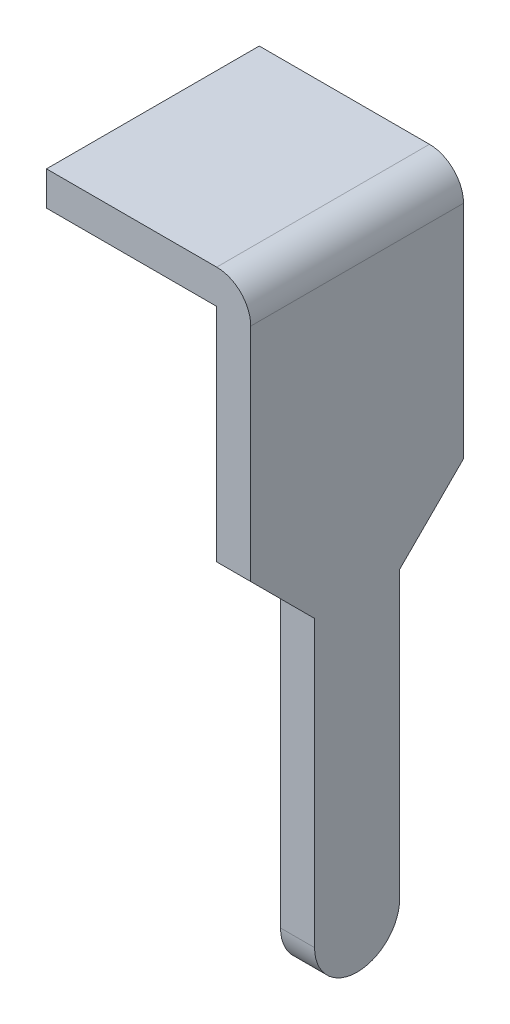
ISO-10303-21;
HEADER;
FILE_DESCRIPTION(('STEP AP214'),'2;1');
FILE_NAME('part.step','',(''),(''),'','','');
FILE_SCHEMA(('AUTOMOTIVE_DESIGN { 1 0 10303 214 1 1 1 1 }'));
ENDSEC;
DATA;
#1=APPLICATION_CONTEXT('core data for automotive mechanical design processes');
#2=APPLICATION_PROTOCOL_DEFINITION('international standard','automotive_design',2000,#1);
#3=PRODUCT_CONTEXT('',#1,'mechanical');
#4=PRODUCT('Part','Part','',(#3));
#5=PRODUCT_RELATED_PRODUCT_CATEGORY('part','',(#4));
#6=PRODUCT_DEFINITION_FORMATION('','',#4);
#7=PRODUCT_DEFINITION_CONTEXT('part definition',#1,'design');
#8=PRODUCT_DEFINITION('design','',#6,#7);
#9=PRODUCT_DEFINITION_SHAPE('','',#8);
#10=(LENGTH_UNIT() NAMED_UNIT(*) SI_UNIT(.MILLI.,.METRE.));
#11=(NAMED_UNIT(*) PLANE_ANGLE_UNIT() SI_UNIT($,.RADIAN.));
#12=(NAMED_UNIT(*) SI_UNIT($,.STERADIAN.) SOLID_ANGLE_UNIT());
#13=UNCERTAINTY_MEASURE_WITH_UNIT(LENGTH_MEASURE(1.E-05),#10,'distance_accuracy_value','');
#14=(GEOMETRIC_REPRESENTATION_CONTEXT(3) GLOBAL_UNCERTAINTY_ASSIGNED_CONTEXT((#13)) GLOBAL_UNIT_ASSIGNED_CONTEXT((#10,
#11,#12)) REPRESENTATION_CONTEXT('',''));
#15=CARTESIAN_POINT('',(0.,0.,0.));
#16=DIRECTION('',(0.,0.,1.));
#17=DIRECTION('',(1.,0.,0.));
#18=AXIS2_PLACEMENT_3D('',#15,#16,#17);
#19=CARTESIAN_POINT('',(2.5,3.7,-12.75));
#20=DIRECTION('',(-1.,0.,0.));
#21=DIRECTION('',(0.,0.,1.));
#22=AXIS2_PLACEMENT_3D('',#19,#20,#21);
#23=PLANE('',#22);
#24=DIRECTION('',(0.,1.,0.));
#25=VECTOR('',#24,1.);
#26=CARTESIAN_POINT('',(2.5,3.7,-10.25));
#27=LINE('',#26,#25);
#28=CARTESIAN_POINT('',(2.49999999999867,3.7,-10.25));
#29=VERTEX_POINT('',#28);
#30=CARTESIAN_POINT('',(2.49999999999867,4.1,-10.25));
#31=VERTEX_POINT('',#30);
#32=EDGE_CURVE('E190',#29,#31,#27,.T.);
#33=ORIENTED_EDGE('',*,*,#32,.T.);
#34=DIRECTION('',(0.,0.,-1.));
#35=VECTOR('',#34,1.);
#36=CARTESIAN_POINT('',(2.499999999998,4.1,-12.75));
#37=LINE('',#36,#35);
#38=CARTESIAN_POINT('',(2.49999999999867,4.1,-12.75));
#39=VERTEX_POINT('',#38);
#40=EDGE_CURVE('E158',#31,#39,#37,.T.);
#41=ORIENTED_EDGE('',*,*,#40,.T.);
#42=DIRECTION('',(0.,1.,0.));
#43=VECTOR('',#42,1.);
#44=CARTESIAN_POINT('',(2.5,3.7,-12.75));
#45=LINE('',#44,#43);
#46=CARTESIAN_POINT('',(2.49999999999867,3.7,-12.75));
#47=VERTEX_POINT('',#46);
#48=EDGE_CURVE('E207',#39,#47,#45,.F.);
#49=ORIENTED_EDGE('',*,*,#48,.T.);
#50=DIRECTION('',(0.,0.,1.));
#51=VECTOR('',#50,1.);
#52=CARTESIAN_POINT('',(2.499999999998,3.7,-10.25));
#53=LINE('',#52,#51);
#54=EDGE_CURVE('E181',#47,#29,#53,.T.);
#55=ORIENTED_EDGE('',*,*,#54,.T.);
#56=EDGE_LOOP('',(#33,#41,#49,#55));
#57=FACE_BOUND('',#56,.T.);
#58=ADVANCED_FACE('F17',(#57),#23,.T.);
#59=CARTESIAN_POINT('',(4.9,3.7,-10.25));
#60=DIRECTION('',(0.,1.,0.));
#61=DIRECTION('',(0.,0.,1.));
#62=AXIS2_PLACEMENT_3D('',#59,#60,#61);
#63=PLANE('',#62);
#64=DIRECTION('',(-1.,0.,0.));
#65=VECTOR('',#64,1.);
#66=CARTESIAN_POINT('',(4.9,3.7,-10.25));
#67=LINE('',#66,#65);
#68=CARTESIAN_POINT('',(4.5,3.7,-10.25));
#69=VERTEX_POINT('',#68);
#70=EDGE_CURVE('E197',#69,#29,#67,.T.);
#71=ORIENTED_EDGE('',*,*,#70,.T.);
#72=ORIENTED_EDGE('',*,*,#54,.F.);
#73=DIRECTION('',(1.,0.,0.));
#74=VECTOR('',#73,1.);
#75=CARTESIAN_POINT('',(4.9,3.7,-12.75));
#76=LINE('',#75,#74);
#77=CARTESIAN_POINT('',(4.5,3.7,-12.75));
#78=VERTEX_POINT('',#77);
#79=EDGE_CURVE('E177',#47,#78,#76,.T.);
#80=ORIENTED_EDGE('',*,*,#79,.T.);
#81=DIRECTION('',(0.,0.,-1.));
#82=VECTOR('',#81,1.);
#83=CARTESIAN_POINT('',(4.5,3.7,-10.25));
#84=LINE('',#83,#82);
#85=EDGE_CURVE('E162',#78,#69,#84,.F.);
#86=ORIENTED_EDGE('',*,*,#85,.T.);
#87=EDGE_LOOP('',(#71,#72,#80,#86));
#88=FACE_BOUND('',#87,.T.);
#89=ADVANCED_FACE('F287',(#88),#63,.F.);
#90=CARTESIAN_POINT('',(4.5,1.1,-10.25));
#91=DIRECTION('',(1.,0.,0.));
#92=DIRECTION('',(0.,0.,-1.));
#93=AXIS2_PLACEMENT_3D('',#90,#91,#92);
#94=PLANE('',#93);
#95=ORIENTED_EDGE('',*,*,#85,.F.);
#96=DIRECTION('',(0.,-1.,0.));
#97=VECTOR('',#96,1.);
#98=CARTESIAN_POINT('',(4.5,3.7,-12.75));
#99=LINE('',#98,#97);
#100=CARTESIAN_POINT('',(4.5,1.1,-12.75));
#101=VERTEX_POINT('',#100);
#102=EDGE_CURVE('E173',#78,#101,#99,.T.);
#103=ORIENTED_EDGE('',*,*,#102,.T.);
#104=DIRECTION('',(0.,0.707106781186548,-0.707106781186548));
#105=VECTOR('',#104,1.);
#106=CARTESIAN_POINT('',(4.5,1.1,-12.75));
#107=LINE('',#106,#105);
#108=CARTESIAN_POINT('',(4.5,0.35,-12.));
#109=VERTEX_POINT('',#108);
#110=EDGE_CURVE('E161',#109,#101,#107,.T.);
#111=ORIENTED_EDGE('',*,*,#110,.F.);
#112=DIRECTION('',(0.,1.,0.));
#113=VECTOR('',#112,1.);
#114=CARTESIAN_POINT('',(4.5,0.35,-12.));
#115=LINE('',#114,#113);
#116=CARTESIAN_POINT('',(4.5,-3.,-12.));
#117=VERTEX_POINT('',#116);
#118=EDGE_CURVE('E75',#117,#109,#115,.T.);
#119=ORIENTED_EDGE('',*,*,#118,.F.);
#120=CARTESIAN_POINT('',(4.5,-3.,-11.5));
#121=DIRECTION('',(-1.,0.,0.));
#122=DIRECTION('',(0.,0.,1.));
#123=AXIS2_PLACEMENT_3D('',#120,#121,#122);
#124=CIRCLE('',#123,0.5);
#125=CARTESIAN_POINT('',(4.5,-3.,-11.));
#126=VERTEX_POINT('',#125);
#127=EDGE_CURVE('E20',#126,#117,#124,.F.);
#128=ORIENTED_EDGE('',*,*,#127,.F.);
#129=DIRECTION('',(0.,1.,0.));
#130=VECTOR('',#129,1.);
#131=CARTESIAN_POINT('',(4.5,0.35,-11.));
#132=LINE('',#131,#130);
#133=CARTESIAN_POINT('',(4.5,0.350000000000001,-11.));
#134=VERTEX_POINT('',#133);
#135=EDGE_CURVE('E59',#134,#126,#132,.F.);
#136=ORIENTED_EDGE('',*,*,#135,.F.);
#137=DIRECTION('',(0.,-0.707106781186548,-0.707106781186548));
#138=VECTOR('',#137,1.);
#139=CARTESIAN_POINT('',(4.5,1.1,-10.25));
#140=LINE('',#139,#138);
#141=CARTESIAN_POINT('',(4.5,1.1,-10.25));
#142=VERTEX_POINT('',#141);
#143=EDGE_CURVE('E149',#142,#134,#140,.T.);
#144=ORIENTED_EDGE('',*,*,#143,.F.);
#145=DIRECTION('',(0.,1.,0.));
#146=VECTOR('',#145,1.);
#147=CARTESIAN_POINT('',(4.5,4.1,-10.25));
#148=LINE('',#147,#146);
#149=EDGE_CURVE('E124',#142,#69,#148,.T.);
#150=ORIENTED_EDGE('',*,*,#149,.T.);
#151=EDGE_LOOP('',(#95,#103,#111,#119,#128,#136,#144,#150));
#152=FACE_BOUND('',#151,.T.);
#153=ADVANCED_FACE('F285',(#152),#94,.F.);
#154=CARTESIAN_POINT('',(4.9,4.1,-12.75));
#155=DIRECTION('',(0.,-1.,0.));
#156=DIRECTION('',(0.,0.,-1.));
#157=AXIS2_PLACEMENT_3D('',#154,#155,#156);
#158=PLANE('',#157);
#159=DIRECTION('',(0.,0.,-1.));
#160=VECTOR('',#159,1.);
#161=CARTESIAN_POINT('',(4.5,4.1,-10.25));
#162=LINE('',#161,#160);
#163=CARTESIAN_POINT('',(4.5,4.1,-12.75));
#164=VERTEX_POINT('',#163);
#165=CARTESIAN_POINT('',(4.5,4.1,-10.25));
#166=VERTEX_POINT('',#165);
#167=EDGE_CURVE('E165',#164,#166,#162,.F.);
#168=ORIENTED_EDGE('',*,*,#167,.F.);
#169=DIRECTION('',(1.,0.,0.));
#170=VECTOR('',#169,1.);
#171=CARTESIAN_POINT('',(4.9,4.1,-12.75));
#172=LINE('',#171,#170);
#173=EDGE_CURVE('E219',#164,#39,#172,.F.);
#174=ORIENTED_EDGE('',*,*,#173,.T.);
#175=ORIENTED_EDGE('',*,*,#40,.F.);
#176=DIRECTION('',(-1.,0.,0.));
#177=VECTOR('',#176,1.);
#178=CARTESIAN_POINT('',(4.9,4.1,-10.25));
#179=LINE('',#178,#177);
#180=EDGE_CURVE('E168',#31,#166,#179,.F.);
#181=ORIENTED_EDGE('',*,*,#180,.T.);
#182=EDGE_LOOP('',(#168,#174,#175,#181));
#183=FACE_BOUND('',#182,.T.);
#184=ADVANCED_FACE('F282',(#183),#158,.F.);
#185=CARTESIAN_POINT('',(4.5,1.1,-12.75));
#186=DIRECTION('',(0.,-0.707106781186548,-0.707106781186548));
#187=DIRECTION('',(0.,0.707106781186548,-0.707106781186548));
#188=AXIS2_PLACEMENT_3D('',#185,#186,#187);
#189=PLANE('',#188);
#190=ORIENTED_EDGE('',*,*,#110,.T.);
#191=DIRECTION('',(1.,0.,0.));
#192=VECTOR('',#191,1.);
#193=CARTESIAN_POINT('',(4.9,1.1,-12.75));
#194=LINE('',#193,#192);
#195=CARTESIAN_POINT('',(4.9,1.1,-12.75));
#196=VERTEX_POINT('',#195);
#197=EDGE_CURVE('E176',#101,#196,#194,.T.);
#198=ORIENTED_EDGE('',*,*,#197,.T.);
#199=DIRECTION('',(0.,-0.707106781186547,0.707106781186548));
#200=VECTOR('',#199,1.);
#201=CARTESIAN_POINT('',(4.9,1.1,-12.75));
#202=LINE('',#201,#200);
#203=CARTESIAN_POINT('',(4.9,0.35,-12.));
#204=VERTEX_POINT('',#203);
#205=EDGE_CURVE('E234',#196,#204,#202,.T.);
#206=ORIENTED_EDGE('',*,*,#205,.T.);
#207=DIRECTION('',(-1.,0.,0.));
#208=VECTOR('',#207,1.);
#209=CARTESIAN_POINT('',(4.5,0.35,-12.));
#210=LINE('',#209,#208);
#211=EDGE_CURVE('E103',#109,#204,#210,.F.);
#212=ORIENTED_EDGE('',*,*,#211,.F.);
#213=EDGE_LOOP('',(#190,#198,#206,#212));
#214=FACE_BOUND('',#213,.T.);
#215=ADVANCED_FACE('F254',(#214),#189,.T.);
#216=CARTESIAN_POINT('',(4.5,0.35,-12.));
#217=DIRECTION('',(0.,0.,-1.));
#218=DIRECTION('',(-1.,0.,0.));
#219=AXIS2_PLACEMENT_3D('',#216,#217,#218);
#220=PLANE('',#219);
#221=ORIENTED_EDGE('',*,*,#118,.T.);
#222=ORIENTED_EDGE('',*,*,#211,.T.);
#223=DIRECTION('',(0.,1.,0.));
#224=VECTOR('',#223,1.);
#225=CARTESIAN_POINT('',(4.9,3.7,-12.));
#226=LINE('',#225,#224);
#227=CARTESIAN_POINT('',(4.9,-3.,-12.));
#228=VERTEX_POINT('',#227);
#229=EDGE_CURVE('E218',#204,#228,#226,.F.);
#230=ORIENTED_EDGE('',*,*,#229,.T.);
#231=DIRECTION('',(-1.,0.,0.));
#232=VECTOR('',#231,1.);
#233=CARTESIAN_POINT('',(4.5,-3.,-12.));
#234=LINE('',#233,#232);
#235=EDGE_CURVE('E98',#117,#228,#234,.F.);
#236=ORIENTED_EDGE('',*,*,#235,.F.);
#237=EDGE_LOOP('',(#221,#222,#230,#236));
#238=FACE_BOUND('',#237,.T.);
#239=ADVANCED_FACE('F252',(#238),#220,.T.);
#240=CARTESIAN_POINT('',(4.5,-3.,-11.5));
#241=DIRECTION('',(-1.,0.,0.));
#242=DIRECTION('',(0.,0.,1.));
#243=AXIS2_PLACEMENT_3D('',#240,#241,#242);
#244=CYLINDRICAL_SURFACE('',#243,0.5);
#245=ORIENTED_EDGE('',*,*,#127,.T.);
#246=ORIENTED_EDGE('',*,*,#235,.T.);
#247=CARTESIAN_POINT('',(4.9,-3.,-11.5));
#248=DIRECTION('',(-1.,0.,0.));
#249=DIRECTION('',(0.,0.,1.));
#250=AXIS2_PLACEMENT_3D('',#247,#248,#249);
#251=CIRCLE('',#250,0.5);
#252=CARTESIAN_POINT('',(4.9,-3.,-11.));
#253=VERTEX_POINT('',#252);
#254=EDGE_CURVE('E141',#228,#253,#251,.T.);
#255=ORIENTED_EDGE('',*,*,#254,.T.);
#256=DIRECTION('',(1.,0.,0.));
#257=VECTOR('',#256,1.);
#258=CARTESIAN_POINT('',(4.5,-3.,-11.));
#259=LINE('',#258,#257);
#260=EDGE_CURVE('E152',#126,#253,#259,.T.);
#261=ORIENTED_EDGE('',*,*,#260,.F.);
#262=EDGE_LOOP('',(#245,#246,#255,#261));
#263=FACE_BOUND('',#262,.T.);
#264=ADVANCED_FACE('F275',(#263),#244,.T.);
#265=CARTESIAN_POINT('',(4.5,0.35,-11.));
#266=DIRECTION('',(0.,0.,1.));
#267=DIRECTION('',(1.,0.,0.));
#268=AXIS2_PLACEMENT_3D('',#265,#266,#267);
#269=PLANE('',#268);
#270=ORIENTED_EDGE('',*,*,#135,.T.);
#271=ORIENTED_EDGE('',*,*,#260,.T.);
#272=DIRECTION('',(0.,1.,0.));
#273=VECTOR('',#272,1.);
#274=CARTESIAN_POINT('',(4.9,3.7,-11.));
#275=LINE('',#274,#273);
#276=CARTESIAN_POINT('',(4.9,0.35,-11.));
#277=VERTEX_POINT('',#276);
#278=EDGE_CURVE('E139',#253,#277,#275,.T.);
#279=ORIENTED_EDGE('',*,*,#278,.T.);
#280=DIRECTION('',(1.,0.,0.));
#281=VECTOR('',#280,1.);
#282=CARTESIAN_POINT('',(4.5,0.350000000000001,-11.));
#283=LINE('',#282,#281);
#284=EDGE_CURVE('E127',#134,#277,#283,.T.);
#285=ORIENTED_EDGE('',*,*,#284,.F.);
#286=EDGE_LOOP('',(#270,#271,#279,#285));
#287=FACE_BOUND('',#286,.T.);
#288=ADVANCED_FACE('F272',(#287),#269,.T.);
#289=CARTESIAN_POINT('',(4.5,1.1,-10.25));
#290=DIRECTION('',(0.,-0.707106781186548,0.707106781186548));
#291=DIRECTION('',(0.,-0.707106781186548,-0.707106781186548));
#292=AXIS2_PLACEMENT_3D('',#289,#290,#291);
#293=PLANE('',#292);
#294=ORIENTED_EDGE('',*,*,#143,.T.);
#295=ORIENTED_EDGE('',*,*,#284,.T.);
#296=DIRECTION('',(0.,0.707106781186548,0.707106781186547));
#297=VECTOR('',#296,1.);
#298=CARTESIAN_POINT('',(4.9,0.35,-11.));
#299=LINE('',#298,#297);
#300=CARTESIAN_POINT('',(4.9,1.1,-10.25));
#301=VERTEX_POINT('',#300);
#302=EDGE_CURVE('E134',#277,#301,#299,.T.);
#303=ORIENTED_EDGE('',*,*,#302,.T.);
#304=DIRECTION('',(-1.,0.,0.));
#305=VECTOR('',#304,1.);
#306=CARTESIAN_POINT('',(4.9,1.1,-10.25));
#307=LINE('',#306,#305);
#308=EDGE_CURVE('E117',#301,#142,#307,.T.);
#309=ORIENTED_EDGE('',*,*,#308,.T.);
#310=EDGE_LOOP('',(#294,#295,#303,#309));
#311=FACE_BOUND('',#310,.T.);
#312=ADVANCED_FACE('F138',(#311),#293,.T.);
#313=CARTESIAN_POINT('',(4.9,4.1,-10.25));
#314=DIRECTION('',(0.,0.,-1.));
#315=DIRECTION('',(-1.,0.,0.));
#316=AXIS2_PLACEMENT_3D('',#313,#314,#315);
#317=PLANE('',#316);
#318=CARTESIAN_POINT('',(4.5,3.7,-10.25));
#319=DIRECTION('',(0.,0.,-1.));
#320=DIRECTION('',(-1.,0.,0.));
#321=AXIS2_PLACEMENT_3D('',#318,#319,#320);
#322=CIRCLE('',#321,0.4);
#323=CARTESIAN_POINT('',(4.9,3.7,-10.25));
#324=VERTEX_POINT('',#323);
#325=EDGE_CURVE('E167',#166,#324,#322,.T.);
#326=ORIENTED_EDGE('',*,*,#325,.F.);
#327=ORIENTED_EDGE('',*,*,#180,.F.);
#328=ORIENTED_EDGE('',*,*,#32,.F.);
#329=ORIENTED_EDGE('',*,*,#70,.F.);
#330=ORIENTED_EDGE('',*,*,#149,.F.);
#331=ORIENTED_EDGE('',*,*,#308,.F.);
#332=DIRECTION('',(0.,1.,0.));
#333=VECTOR('',#332,1.);
#334=CARTESIAN_POINT('',(4.9,3.7,-10.25));
#335=LINE('',#334,#333);
#336=EDGE_CURVE('E121',#301,#324,#335,.T.);
#337=ORIENTED_EDGE('',*,*,#336,.T.);
#338=EDGE_LOOP('',(#326,#327,#328,#329,#330,#331,#337));
#339=FACE_BOUND('',#338,.T.);
#340=ADVANCED_FACE('F120',(#339),#317,.F.);
#341=CARTESIAN_POINT('',(4.5,3.7,-10.25));
#342=DIRECTION('',(0.,0.,-1.));
#343=DIRECTION('',(-1.,0.,0.));
#344=AXIS2_PLACEMENT_3D('',#341,#342,#343);
#345=CYLINDRICAL_SURFACE('',#344,0.4);
#346=ORIENTED_EDGE('',*,*,#325,.T.);
#347=DIRECTION('',(0.,0.,1.));
#348=VECTOR('',#347,1.);
#349=CARTESIAN_POINT('',(4.9,3.7,-10.25));
#350=LINE('',#349,#348);
#351=CARTESIAN_POINT('',(4.9,3.7,-12.75));
#352=VERTEX_POINT('',#351);
#353=EDGE_CURVE('E26',#324,#352,#350,.F.);
#354=ORIENTED_EDGE('',*,*,#353,.T.);
#355=CARTESIAN_POINT('',(4.5,3.7,-12.75));
#356=DIRECTION('',(0.,0.,-1.));
#357=DIRECTION('',(-1.,0.,0.));
#358=AXIS2_PLACEMENT_3D('',#355,#356,#357);
#359=CIRCLE('',#358,0.4);
#360=EDGE_CURVE('E34',#352,#164,#359,.F.);
#361=ORIENTED_EDGE('',*,*,#360,.T.);
#362=ORIENTED_EDGE('',*,*,#167,.T.);
#363=EDGE_LOOP('',(#346,#354,#361,#362));
#364=FACE_BOUND('',#363,.T.);
#365=ADVANCED_FACE('F221',(#364),#345,.T.);
#366=CARTESIAN_POINT('',(4.9,3.7,-12.75));
#367=DIRECTION('',(0.,0.,1.));
#368=DIRECTION('',(0.,-1.,0.));
#369=AXIS2_PLACEMENT_3D('',#366,#367,#368);
#370=PLANE('',#369);
#371=ORIENTED_EDGE('',*,*,#360,.F.);
#372=DIRECTION('',(0.,1.,0.));
#373=VECTOR('',#372,1.);
#374=CARTESIAN_POINT('',(4.9,3.7,-12.75));
#375=LINE('',#374,#373);
#376=EDGE_CURVE('E11',#352,#196,#375,.F.);
#377=ORIENTED_EDGE('',*,*,#376,.T.);
#378=ORIENTED_EDGE('',*,*,#197,.F.);
#379=ORIENTED_EDGE('',*,*,#102,.F.);
#380=ORIENTED_EDGE('',*,*,#79,.F.);
#381=ORIENTED_EDGE('',*,*,#48,.F.);
#382=ORIENTED_EDGE('',*,*,#173,.F.);
#383=EDGE_LOOP('',(#371,#377,#378,#379,#380,#381,#382));
#384=FACE_BOUND('',#383,.T.);
#385=ADVANCED_FACE('F257',(#384),#370,.F.);
#386=CARTESIAN_POINT('',(4.9,3.7,-10.25));
#387=DIRECTION('',(-1.,0.,0.));
#388=DIRECTION('',(0.,0.,1.));
#389=AXIS2_PLACEMENT_3D('',#386,#387,#388);
#390=PLANE('',#389);
#391=ORIENTED_EDGE('',*,*,#353,.F.);
#392=ORIENTED_EDGE('',*,*,#336,.F.);
#393=ORIENTED_EDGE('',*,*,#302,.F.);
#394=ORIENTED_EDGE('',*,*,#278,.F.);
#395=ORIENTED_EDGE('',*,*,#254,.F.);
#396=ORIENTED_EDGE('',*,*,#229,.F.);
#397=ORIENTED_EDGE('',*,*,#205,.F.);
#398=ORIENTED_EDGE('',*,*,#376,.F.);
#399=EDGE_LOOP('',(#391,#392,#393,#394,#395,#396,#397,#398));
#400=FACE_BOUND('',#399,.T.);
#401=ADVANCED_FACE('F132',(#400),#390,.F.);
#402=CLOSED_SHELL('',(#58,#89,#153,#184,#215,#239,#264,#288,#312,#340,#365,#385,#401));
#403=MANIFOLD_SOLID_BREP('B1',#402);
#404=ADVANCED_BREP_SHAPE_REPRESENTATION('',(#18,#403),#14);
#405=SHAPE_DEFINITION_REPRESENTATION(#9,#404);
ENDSEC;
END-ISO-10303-21;
